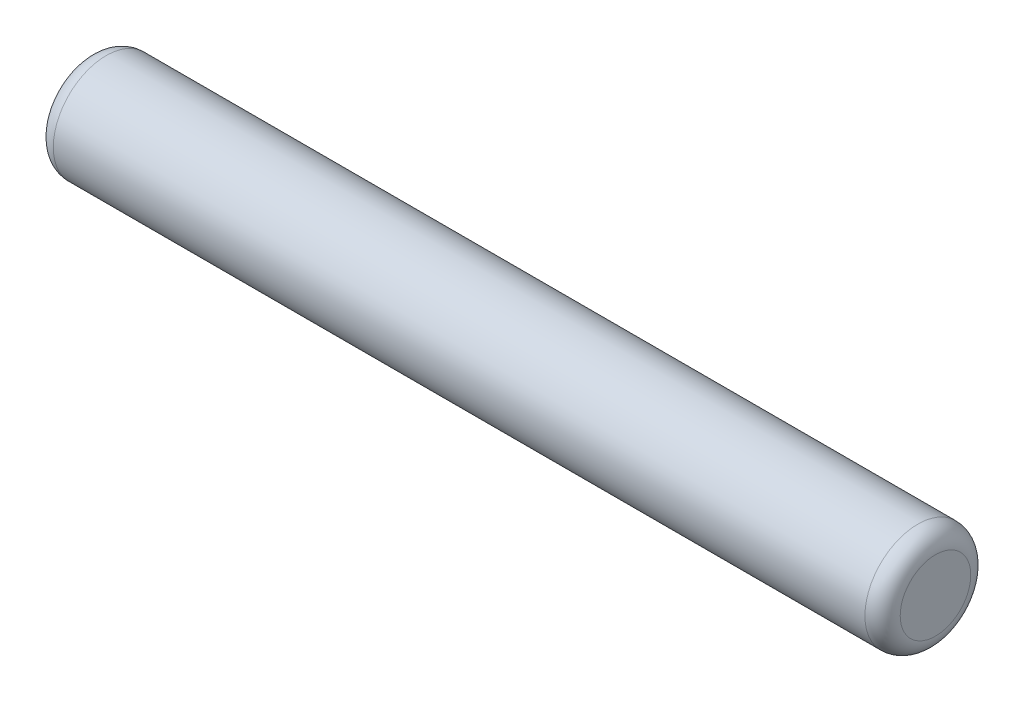
ISO-10303-21;
HEADER;
FILE_DESCRIPTION(('STEP AP214'),'2;1');
FILE_NAME('part.step','',(''),(''),'','','');
FILE_SCHEMA(('AUTOMOTIVE_DESIGN { 1 0 10303 214 1 1 1 1 }'));
ENDSEC;
DATA;
#1=APPLICATION_CONTEXT('core data for automotive mechanical design processes');
#2=APPLICATION_PROTOCOL_DEFINITION('international standard','automotive_design',2000,#1);
#3=PRODUCT_CONTEXT('',#1,'mechanical');
#4=PRODUCT('Part','Part','',(#3));
#5=PRODUCT_RELATED_PRODUCT_CATEGORY('part','',(#4));
#6=PRODUCT_DEFINITION_FORMATION('','',#4);
#7=PRODUCT_DEFINITION_CONTEXT('part definition',#1,'design');
#8=PRODUCT_DEFINITION('design','',#6,#7);
#9=PRODUCT_DEFINITION_SHAPE('','',#8);
#10=(LENGTH_UNIT() NAMED_UNIT(*) SI_UNIT(.MILLI.,.METRE.));
#11=(NAMED_UNIT(*) PLANE_ANGLE_UNIT() SI_UNIT($,.RADIAN.));
#12=(NAMED_UNIT(*) SI_UNIT($,.STERADIAN.) SOLID_ANGLE_UNIT());
#13=UNCERTAINTY_MEASURE_WITH_UNIT(LENGTH_MEASURE(1.E-05),#10,'distance_accuracy_value','');
#14=(GEOMETRIC_REPRESENTATION_CONTEXT(3) GLOBAL_UNCERTAINTY_ASSIGNED_CONTEXT((#13)) GLOBAL_UNIT_ASSIGNED_CONTEXT((#10,
#11,#12)) REPRESENTATION_CONTEXT('',''));
#15=CARTESIAN_POINT('',(0.,0.,0.));
#16=DIRECTION('',(0.,0.,1.));
#17=DIRECTION('',(1.,0.,0.));
#18=AXIS2_PLACEMENT_3D('',#15,#16,#17);
#19=CARTESIAN_POINT('',(0.,0.,0.));
#20=DIRECTION('',(1.,0.,0.));
#21=DIRECTION('',(0.,0.,-1.));
#22=AXIS2_PLACEMENT_3D('',#19,#20,#21);
#23=PLANE('',#22);
#24=CARTESIAN_POINT('',(0.,0.,0.));
#25=DIRECTION('',(-1.,0.,0.));
#26=DIRECTION('',(0.,0.,1.));
#27=AXIS2_PLACEMENT_3D('',#24,#25,#26);
#28=CIRCLE('',#27,3.175);
#29=CARTESIAN_POINT('',(0.,0.,3.175));
#30=VERTEX_POINT('',#29);
#31=EDGE_CURVE('E10',#30,#30,#28,.T.);
#32=ORIENTED_EDGE('',*,*,#31,.T.);
#33=EDGE_LOOP('',(#32));
#34=FACE_BOUND('',#33,.T.);
#35=ADVANCED_FACE('F33',(#34),#23,.F.);
#36=CARTESIAN_POINT('',(1.5875,0.,0.));
#37=DIRECTION('',(-1.,0.,0.));
#38=DIRECTION('',(0.,0.,1.));
#39=AXIS2_PLACEMENT_3D('',#36,#37,#38);
#40=TOROIDAL_SURFACE('',#39,3.175,1.5875);
#41=ORIENTED_EDGE('',*,*,#31,.F.);
#42=EDGE_LOOP('',(#41));
#43=FACE_BOUND('',#42,.T.);
#44=CARTESIAN_POINT('',(1.5875,0.,0.));
#45=DIRECTION('',(-1.,0.,0.));
#46=DIRECTION('',(0.,0.,1.));
#47=AXIS2_PLACEMENT_3D('',#44,#45,#46);
#48=CIRCLE('',#47,4.7625);
#49=CARTESIAN_POINT('',(1.5875,0.,4.7625));
#50=VERTEX_POINT('',#49);
#51=EDGE_CURVE('E39',#50,#50,#48,.T.);
#52=ORIENTED_EDGE('',*,*,#51,.T.);
#53=EDGE_LOOP('',(#52));
#54=FACE_BOUND('',#53,.T.);
#55=ADVANCED_FACE('F65',(#43,#54),#40,.T.);
#56=CARTESIAN_POINT('',(-7.3603503857893,0.,0.));
#57=DIRECTION('',(-1.,0.,0.));
#58=DIRECTION('',(0.,0.,1.));
#59=AXIS2_PLACEMENT_3D('',#56,#57,#58);
#60=CYLINDRICAL_SURFACE('',#59,4.7625);
#61=ORIENTED_EDGE('',*,*,#51,.F.);
#62=EDGE_LOOP('',(#61));
#63=FACE_BOUND('',#62,.T.);
#64=CARTESIAN_POINT('',(74.6125,0.,0.));
#65=DIRECTION('',(-1.,0.,0.));
#66=DIRECTION('',(0.,0.,1.));
#67=AXIS2_PLACEMENT_3D('',#64,#65,#66);
#68=CIRCLE('',#67,4.7625);
#69=CARTESIAN_POINT('',(74.6125,0.,4.7625));
#70=VERTEX_POINT('',#69);
#71=EDGE_CURVE('E43',#70,#70,#68,.T.);
#72=ORIENTED_EDGE('',*,*,#71,.T.);
#73=EDGE_LOOP('',(#72));
#74=FACE_BOUND('',#73,.T.);
#75=ADVANCED_FACE('F61',(#63,#74),#60,.T.);
#76=CARTESIAN_POINT('',(74.6125,0.,0.));
#77=DIRECTION('',(-1.,0.,0.));
#78=DIRECTION('',(0.,0.,1.));
#79=AXIS2_PLACEMENT_3D('',#76,#77,#78);
#80=TOROIDAL_SURFACE('',#79,3.175,1.5875);
#81=ORIENTED_EDGE('',*,*,#71,.F.);
#82=EDGE_LOOP('',(#81));
#83=FACE_BOUND('',#82,.T.);
#84=CARTESIAN_POINT('',(76.2,0.,0.));
#85=DIRECTION('',(-1.,0.,0.));
#86=DIRECTION('',(0.,0.,1.));
#87=AXIS2_PLACEMENT_3D('',#84,#85,#86);
#88=CIRCLE('',#87,3.175);
#89=CARTESIAN_POINT('',(76.2,0.,3.175));
#90=VERTEX_POINT('',#89);
#91=EDGE_CURVE('E47',#90,#90,#88,.T.);
#92=ORIENTED_EDGE('',*,*,#91,.T.);
#93=EDGE_LOOP('',(#92));
#94=FACE_BOUND('',#93,.T.);
#95=ADVANCED_FACE('F53',(#83,#94),#80,.T.);
#96=CARTESIAN_POINT('',(76.2,3.175,0.));
#97=DIRECTION('',(-1.,0.,0.));
#98=DIRECTION('',(0.,0.,1.));
#99=AXIS2_PLACEMENT_3D('',#96,#97,#98);
#100=PLANE('',#99);
#101=ORIENTED_EDGE('',*,*,#91,.F.);
#102=EDGE_LOOP('',(#101));
#103=FACE_BOUND('',#102,.T.);
#104=ADVANCED_FACE('F55',(#103),#100,.F.);
#105=CLOSED_SHELL('',(#35,#55,#75,#95,#104));
#106=MANIFOLD_SOLID_BREP('B2',#105);
#107=ADVANCED_BREP_SHAPE_REPRESENTATION('',(#18,#106),#14);
#108=SHAPE_DEFINITION_REPRESENTATION(#9,#107);
ENDSEC;
END-ISO-10303-21;
